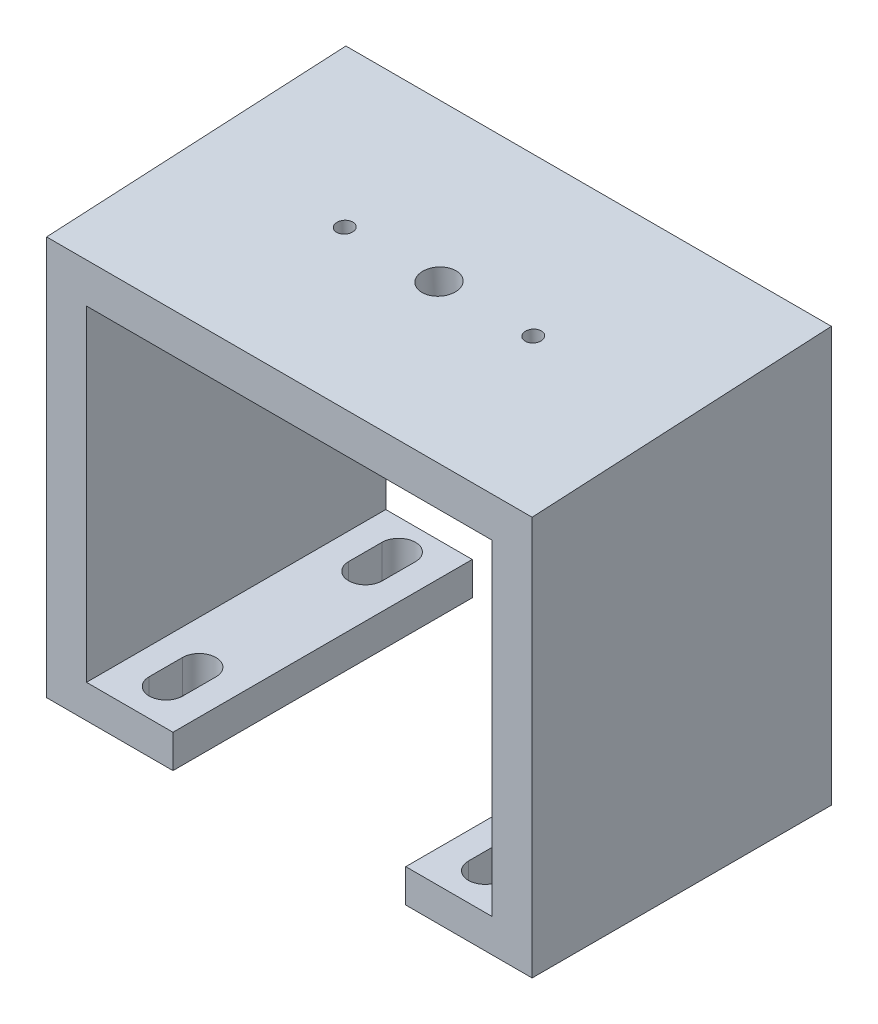
ISO-10303-21;
HEADER;
FILE_DESCRIPTION(('STEP AP214'),'2;1');
FILE_NAME('part.step','',(''),(''),'','','');
FILE_SCHEMA(('AUTOMOTIVE_DESIGN { 1 0 10303 214 1 1 1 1 }'));
ENDSEC;
DATA;
#1=APPLICATION_CONTEXT('core data for automotive mechanical design processes');
#2=APPLICATION_PROTOCOL_DEFINITION('international standard','automotive_design',2000,#1);
#3=PRODUCT_CONTEXT('',#1,'mechanical');
#4=PRODUCT('Part','Part','',(#3));
#5=PRODUCT_RELATED_PRODUCT_CATEGORY('part','',(#4));
#6=PRODUCT_DEFINITION_FORMATION('','',#4);
#7=PRODUCT_DEFINITION_CONTEXT('part definition',#1,'design');
#8=PRODUCT_DEFINITION('design','',#6,#7);
#9=PRODUCT_DEFINITION_SHAPE('','',#8);
#10=(LENGTH_UNIT() NAMED_UNIT(*) SI_UNIT(.MILLI.,.METRE.));
#11=(NAMED_UNIT(*) PLANE_ANGLE_UNIT() SI_UNIT($,.RADIAN.));
#12=(NAMED_UNIT(*) SI_UNIT($,.STERADIAN.) SOLID_ANGLE_UNIT());
#13=UNCERTAINTY_MEASURE_WITH_UNIT(LENGTH_MEASURE(1.E-05),#10,'distance_accuracy_value','');
#14=(GEOMETRIC_REPRESENTATION_CONTEXT(3) GLOBAL_UNCERTAINTY_ASSIGNED_CONTEXT((#13)) GLOBAL_UNIT_ASSIGNED_CONTEXT((#10,
#11,#12)) REPRESENTATION_CONTEXT('',''));
#15=CARTESIAN_POINT('',(0.,0.,0.));
#16=DIRECTION('',(0.,0.,1.));
#17=DIRECTION('',(1.,0.,0.));
#18=AXIS2_PLACEMENT_3D('',#15,#16,#17);
#19=CARTESIAN_POINT('',(38.735,-69.85,57.15));
#20=DIRECTION('',(0.,-1.,0.));
#21=DIRECTION('',(0.,0.,-1.));
#22=AXIS2_PLACEMENT_3D('',#19,#20,#21);
#23=PLANE('',#22);
#24=CARTESIAN_POINT('',(30.48,-69.85,50.2348227778499));
#25=DIRECTION('',(0.,-1.,0.));
#26=DIRECTION('',(0.,0.,1.));
#27=AXIS2_PLACEMENT_3D('',#24,#25,#26);
#28=CIRCLE('',#27,3.20294);
#29=CARTESIAN_POINT('',(33.68294,-69.85,50.2348227778499));
#30=VERTEX_POINT('',#29);
#31=CARTESIAN_POINT('',(27.27706,-69.85,50.2348227778499));
#32=VERTEX_POINT('',#31);
#33=EDGE_CURVE('E68',#30,#32,#28,.T.);
#34=ORIENTED_EDGE('',*,*,#33,.T.);
#35=DIRECTION('',(0.,0.,-1.));
#36=VECTOR('',#35,1.);
#37=CARTESIAN_POINT('',(27.27706,-69.85,50.2348227778499));
#38=LINE('',#37,#36);
#39=CARTESIAN_POINT('',(27.27706,-69.85,43.8848227778499));
#40=VERTEX_POINT('',#39);
#41=EDGE_CURVE('E299',#32,#40,#38,.T.);
#42=ORIENTED_EDGE('',*,*,#41,.T.);
#43=CARTESIAN_POINT('',(30.48,-69.85,43.8848227778499));
#44=DIRECTION('',(0.,-1.,0.));
#45=DIRECTION('',(0.,0.,1.));
#46=AXIS2_PLACEMENT_3D('',#43,#44,#45);
#47=CIRCLE('',#46,3.20294);
#48=CARTESIAN_POINT('',(33.68294,-69.85,43.8848227778499));
#49=VERTEX_POINT('',#48);
#50=EDGE_CURVE('E311',#40,#49,#47,.T.);
#51=ORIENTED_EDGE('',*,*,#50,.T.);
#52=DIRECTION('',(0.,0.,1.));
#53=VECTOR('',#52,1.);
#54=CARTESIAN_POINT('',(33.68294,-69.85,50.2348227778499));
#55=LINE('',#54,#53);
#56=EDGE_CURVE('E308',#49,#30,#55,.T.);
#57=ORIENTED_EDGE('',*,*,#56,.T.);
#58=EDGE_LOOP('',(#34,#42,#51,#57));
#59=FACE_BOUND('',#58,.T.);
#60=DIRECTION('',(-1.,0.,0.));
#61=VECTOR('',#60,1.);
#62=CARTESIAN_POINT('',(38.735,-69.85,0.));
#63=LINE('',#62,#61);
#64=CARTESIAN_POINT('',(38.735,-69.85,0.));
#65=VERTEX_POINT('',#64);
#66=CARTESIAN_POINT('',(22.225,-69.85,0.));
#67=VERTEX_POINT('',#66);
#68=EDGE_CURVE('E427',#65,#67,#63,.T.);
#69=ORIENTED_EDGE('',*,*,#68,.T.);
#70=DIRECTION('',(0.,0.,-1.));
#71=VECTOR('',#70,1.);
#72=CARTESIAN_POINT('',(22.225,-69.85,57.15));
#73=LINE('',#72,#71);
#74=CARTESIAN_POINT('',(22.225,-69.85,57.15));
#75=VERTEX_POINT('',#74);
#76=EDGE_CURVE('E439',#75,#67,#73,.T.);
#77=ORIENTED_EDGE('',*,*,#76,.F.);
#78=DIRECTION('',(-1.,0.,0.));
#79=VECTOR('',#78,1.);
#80=CARTESIAN_POINT('',(38.735,-69.85,57.15));
#81=LINE('',#80,#79);
#82=CARTESIAN_POINT('',(38.735,-69.85,57.15));
#83=VERTEX_POINT('',#82);
#84=EDGE_CURVE('E401',#83,#75,#81,.T.);
#85=ORIENTED_EDGE('',*,*,#84,.F.);
#86=DIRECTION('',(0.,0.,-1.));
#87=VECTOR('',#86,1.);
#88=CARTESIAN_POINT('',(38.735,-69.85,57.15));
#89=LINE('',#88,#87);
#90=EDGE_CURVE('E442',#83,#65,#89,.T.);
#91=ORIENTED_EDGE('',*,*,#90,.T.);
#92=EDGE_LOOP('',(#69,#77,#85,#91));
#93=FACE_BOUND('',#92,.T.);
#94=CARTESIAN_POINT('',(30.48,-69.85,5.78482277784992));
#95=DIRECTION('',(0.,-1.,0.));
#96=DIRECTION('',(0.,0.,1.));
#97=AXIS2_PLACEMENT_3D('',#94,#95,#96);
#98=CIRCLE('',#97,3.20294);
#99=CARTESIAN_POINT('',(27.27706,-69.85,5.78482277784992));
#100=VERTEX_POINT('',#99);
#101=CARTESIAN_POINT('',(33.68294,-69.85,5.78482277784992));
#102=VERTEX_POINT('',#101);
#103=EDGE_CURVE('E60',#100,#102,#98,.T.);
#104=ORIENTED_EDGE('',*,*,#103,.T.);
#105=DIRECTION('',(0.,0.,1.));
#106=VECTOR('',#105,1.);
#107=CARTESIAN_POINT('',(33.68294,-69.85,5.78482277784992));
#108=LINE('',#107,#106);
#109=CARTESIAN_POINT('',(33.68294,-69.85,12.1348227778499));
#110=VERTEX_POINT('',#109);
#111=EDGE_CURVE('E270',#102,#110,#108,.T.);
#112=ORIENTED_EDGE('',*,*,#111,.T.);
#113=CARTESIAN_POINT('',(30.48,-69.85,12.1348227778499));
#114=DIRECTION('',(0.,-1.,0.));
#115=DIRECTION('',(0.,0.,1.));
#116=AXIS2_PLACEMENT_3D('',#113,#114,#115);
#117=CIRCLE('',#116,3.20294);
#118=CARTESIAN_POINT('',(27.27706,-69.85,12.1348227778499));
#119=VERTEX_POINT('',#118);
#120=EDGE_CURVE('E283',#110,#119,#117,.T.);
#121=ORIENTED_EDGE('',*,*,#120,.T.);
#122=DIRECTION('',(0.,0.,-1.));
#123=VECTOR('',#122,1.);
#124=CARTESIAN_POINT('',(27.27706,-69.85,5.78482277784992));
#125=LINE('',#124,#123);
#126=EDGE_CURVE('E279',#119,#100,#125,.T.);
#127=ORIENTED_EDGE('',*,*,#126,.T.);
#128=EDGE_LOOP('',(#104,#112,#121,#127));
#129=FACE_BOUND('',#128,.T.);
#130=ADVANCED_FACE('F45',(#59,#93,#129),#23,.F.);
#131=CARTESIAN_POINT('',(46.355,-76.2,57.15));
#132=DIRECTION('',(0.,-1.,0.));
#133=DIRECTION('',(0.,0.,-1.));
#134=AXIS2_PLACEMENT_3D('',#131,#132,#133);
#135=PLANE('',#134);
#136=DIRECTION('',(-1.,0.,0.));
#137=VECTOR('',#136,1.);
#138=CARTESIAN_POINT('',(46.355,-76.2,0.));
#139=LINE('',#138,#137);
#140=CARTESIAN_POINT('',(46.355,-76.2,0.));
#141=VERTEX_POINT('',#140);
#142=CARTESIAN_POINT('',(22.225,-76.2,0.));
#143=VERTEX_POINT('',#142);
#144=EDGE_CURVE('E432',#141,#143,#139,.T.);
#145=ORIENTED_EDGE('',*,*,#144,.F.);
#146=DIRECTION('',(0.,0.,-1.));
#147=VECTOR('',#146,1.);
#148=CARTESIAN_POINT('',(46.355,-76.2,57.15));
#149=LINE('',#148,#147);
#150=CARTESIAN_POINT('',(46.355,-76.2,57.15));
#151=VERTEX_POINT('',#150);
#152=EDGE_CURVE('E412',#151,#141,#149,.T.);
#153=ORIENTED_EDGE('',*,*,#152,.F.);
#154=DIRECTION('',(-1.,0.,0.));
#155=VECTOR('',#154,1.);
#156=CARTESIAN_POINT('',(46.355,-76.2,57.15));
#157=LINE('',#156,#155);
#158=CARTESIAN_POINT('',(22.225,-76.2,57.15));
#159=VERTEX_POINT('',#158);
#160=EDGE_CURVE('E405',#151,#159,#157,.T.);
#161=ORIENTED_EDGE('',*,*,#160,.T.);
#162=DIRECTION('',(0.,0.,-1.));
#163=VECTOR('',#162,1.);
#164=CARTESIAN_POINT('',(22.225,-76.2,57.15));
#165=LINE('',#164,#163);
#166=EDGE_CURVE('E437',#159,#143,#165,.T.);
#167=ORIENTED_EDGE('',*,*,#166,.T.);
#168=EDGE_LOOP('',(#145,#153,#161,#167));
#169=FACE_BOUND('',#168,.T.);
#170=DIRECTION('',(0.,0.,-1.));
#171=VECTOR('',#170,1.);
#172=CARTESIAN_POINT('',(27.27706,-76.2,50.2348227778499));
#173=LINE('',#172,#171);
#174=CARTESIAN_POINT('',(27.27706,-76.2,50.2348227778499));
#175=VERTEX_POINT('',#174);
#176=CARTESIAN_POINT('',(27.27706,-76.2,43.8848227778499));
#177=VERTEX_POINT('',#176);
#178=EDGE_CURVE('E304',#175,#177,#173,.T.);
#179=ORIENTED_EDGE('',*,*,#178,.F.);
#180=CARTESIAN_POINT('',(30.48,-76.2,50.2348227778499));
#181=DIRECTION('',(0.,-1.,0.));
#182=DIRECTION('',(0.,0.,1.));
#183=AXIS2_PLACEMENT_3D('',#180,#181,#182);
#184=CIRCLE('',#183,3.20294);
#185=CARTESIAN_POINT('',(33.68294,-76.2,50.2348227778499));
#186=VERTEX_POINT('',#185);
#187=EDGE_CURVE('E296',#186,#175,#184,.T.);
#188=ORIENTED_EDGE('',*,*,#187,.F.);
#189=DIRECTION('',(0.,0.,1.));
#190=VECTOR('',#189,1.);
#191=CARTESIAN_POINT('',(33.68294,-76.2,50.2348227778499));
#192=LINE('',#191,#190);
#193=CARTESIAN_POINT('',(33.68294,-76.2,43.8848227778499));
#194=VERTEX_POINT('',#193);
#195=EDGE_CURVE('E298',#194,#186,#192,.T.);
#196=ORIENTED_EDGE('',*,*,#195,.F.);
#197=CARTESIAN_POINT('',(30.48,-76.2,43.8848227778499));
#198=DIRECTION('',(0.,-1.,0.));
#199=DIRECTION('',(0.,0.,1.));
#200=AXIS2_PLACEMENT_3D('',#197,#198,#199);
#201=CIRCLE('',#200,3.20294);
#202=EDGE_CURVE('E301',#177,#194,#201,.T.);
#203=ORIENTED_EDGE('',*,*,#202,.F.);
#204=EDGE_LOOP('',(#179,#188,#196,#203));
#205=FACE_BOUND('',#204,.T.);
#206=DIRECTION('',(0.,0.,1.));
#207=VECTOR('',#206,1.);
#208=CARTESIAN_POINT('',(33.68294,-76.2,5.78482277784992));
#209=LINE('',#208,#207);
#210=CARTESIAN_POINT('',(33.68294,-76.2,5.78482277784992));
#211=VERTEX_POINT('',#210);
#212=CARTESIAN_POINT('',(33.68294,-76.2,12.1348227778499));
#213=VERTEX_POINT('',#212);
#214=EDGE_CURVE('E275',#211,#213,#209,.T.);
#215=ORIENTED_EDGE('',*,*,#214,.F.);
#216=CARTESIAN_POINT('',(30.48,-76.2,5.78482277784992));
#217=DIRECTION('',(0.,-1.,0.));
#218=DIRECTION('',(0.,0.,1.));
#219=AXIS2_PLACEMENT_3D('',#216,#217,#218);
#220=CIRCLE('',#219,3.20294);
#221=CARTESIAN_POINT('',(27.27706,-76.2,5.78482277784992));
#222=VERTEX_POINT('',#221);
#223=EDGE_CURVE('E267',#222,#211,#220,.T.);
#224=ORIENTED_EDGE('',*,*,#223,.F.);
#225=DIRECTION('',(0.,0.,-1.));
#226=VECTOR('',#225,1.);
#227=CARTESIAN_POINT('',(27.27706,-76.2,5.78482277784992));
#228=LINE('',#227,#226);
#229=CARTESIAN_POINT('',(27.27706,-76.2,12.1348227778499));
#230=VERTEX_POINT('',#229);
#231=EDGE_CURVE('E269',#230,#222,#228,.T.);
#232=ORIENTED_EDGE('',*,*,#231,.F.);
#233=CARTESIAN_POINT('',(30.48,-76.2,12.1348227778499));
#234=DIRECTION('',(0.,-1.,0.));
#235=DIRECTION('',(0.,0.,1.));
#236=AXIS2_PLACEMENT_3D('',#233,#234,#235);
#237=CIRCLE('',#236,3.20294);
#238=EDGE_CURVE('E272',#213,#230,#237,.T.);
#239=ORIENTED_EDGE('',*,*,#238,.F.);
#240=EDGE_LOOP('',(#215,#224,#232,#239));
#241=FACE_BOUND('',#240,.T.);
#242=ADVANCED_FACE('F476',(#169,#205,#241),#135,.T.);
#243=CARTESIAN_POINT('',(-46.355,0.,57.15));
#244=DIRECTION('',(1.,0.,0.));
#245=DIRECTION('',(0.,1.,0.));
#246=AXIS2_PLACEMENT_3D('',#243,#244,#245);
#247=PLANE('',#246);
#248=DIRECTION('',(0.,-1.,0.));
#249=VECTOR('',#248,1.);
#250=CARTESIAN_POINT('',(-46.355,0.,0.));
#251=LINE('',#250,#249);
#252=CARTESIAN_POINT('',(-46.355,2.9951045860254,0.));
#253=VERTEX_POINT('',#252);
#254=CARTESIAN_POINT('',(-46.355,-76.2,0.));
#255=VERTEX_POINT('',#254);
#256=EDGE_CURVE('E234',#253,#255,#251,.T.);
#257=ORIENTED_EDGE('',*,*,#256,.T.);
#258=DIRECTION('',(0.,0.,-1.));
#259=VECTOR('',#258,1.);
#260=CARTESIAN_POINT('',(-46.355,-76.2,57.15));
#261=LINE('',#260,#259);
#262=CARTESIAN_POINT('',(-46.355,-76.2,57.15));
#263=VERTEX_POINT('',#262);
#264=EDGE_CURVE('E11',#263,#255,#261,.T.);
#265=ORIENTED_EDGE('',*,*,#264,.F.);
#266=DIRECTION('',(0.,-1.,0.));
#267=VECTOR('',#266,1.);
#268=CARTESIAN_POINT('',(-46.355,0.,57.15));
#269=LINE('',#268,#267);
#270=CARTESIAN_POINT('',(-46.355,0.,57.15));
#271=VERTEX_POINT('',#270);
#272=EDGE_CURVE('E257',#271,#263,#269,.T.);
#273=ORIENTED_EDGE('',*,*,#272,.F.);
#274=DIRECTION('',(0.,0.0523359562429368,-0.998629534754574));
#275=VECTOR('',#274,1.);
#276=CARTESIAN_POINT('',(-46.355,2.9951045860254,0.));
#277=LINE('',#276,#275);
#278=EDGE_CURVE('E252',#271,#253,#277,.T.);
#279=ORIENTED_EDGE('',*,*,#278,.T.);
#280=EDGE_LOOP('',(#257,#265,#273,#279));
#281=FACE_BOUND('',#280,.T.);
#282=ADVANCED_FACE('F47',(#281),#247,.F.);
#283=CARTESIAN_POINT('',(-46.355,-76.2,57.15));
#284=DIRECTION('',(0.,1.,0.));
#285=DIRECTION('',(0.,0.,1.));
#286=AXIS2_PLACEMENT_3D('',#283,#284,#285);
#287=PLANE('',#286);
#288=DIRECTION('',(0.,0.,-1.));
#289=VECTOR('',#288,1.);
#290=CARTESIAN_POINT('',(-27.27706,-76.2,5.78482277784992));
#291=LINE('',#290,#289);
#292=CARTESIAN_POINT('',(-27.27706,-76.2,12.1348227778499));
#293=VERTEX_POINT('',#292);
#294=CARTESIAN_POINT('',(-27.27706,-76.2,5.78482277784992));
#295=VERTEX_POINT('',#294);
#296=EDGE_CURVE('E332',#293,#295,#291,.T.);
#297=ORIENTED_EDGE('',*,*,#296,.T.);
#298=CARTESIAN_POINT('',(-30.48,-76.2,5.78482277784992));
#299=DIRECTION('',(0.,1.,0.));
#300=DIRECTION('',(0.,0.,1.));
#301=AXIS2_PLACEMENT_3D('',#298,#299,#300);
#302=CIRCLE('',#301,3.20294);
#303=CARTESIAN_POINT('',(-33.68294,-76.2,5.78482277784992));
#304=VERTEX_POINT('',#303);
#305=EDGE_CURVE('E322',#295,#304,#302,.T.);
#306=ORIENTED_EDGE('',*,*,#305,.T.);
#307=DIRECTION('',(0.,0.,1.));
#308=VECTOR('',#307,1.);
#309=CARTESIAN_POINT('',(-33.68294,-76.2,5.78482277784992));
#310=LINE('',#309,#308);
#311=CARTESIAN_POINT('',(-33.68294,-76.2,12.1348227778499));
#312=VERTEX_POINT('',#311);
#313=EDGE_CURVE('E325',#304,#312,#310,.T.);
#314=ORIENTED_EDGE('',*,*,#313,.T.);
#315=CARTESIAN_POINT('',(-30.48,-76.2,12.1348227778499));
#316=DIRECTION('',(0.,1.,0.));
#317=DIRECTION('',(0.,0.,1.));
#318=AXIS2_PLACEMENT_3D('',#315,#316,#317);
#319=CIRCLE('',#318,3.20294);
#320=EDGE_CURVE('E329',#312,#293,#319,.T.);
#321=ORIENTED_EDGE('',*,*,#320,.T.);
#322=EDGE_LOOP('',(#297,#306,#314,#321));
#323=FACE_BOUND('',#322,.T.);
#324=DIRECTION('',(0.,0.,1.));
#325=VECTOR('',#324,1.);
#326=CARTESIAN_POINT('',(-33.68294,-76.2,50.2348227778499));
#327=LINE('',#326,#325);
#328=CARTESIAN_POINT('',(-33.68294,-76.2,43.8848227778499));
#329=VERTEX_POINT('',#328);
#330=CARTESIAN_POINT('',(-33.68294,-76.2,50.2348227778499));
#331=VERTEX_POINT('',#330);
#332=EDGE_CURVE('E357',#329,#331,#327,.T.);
#333=ORIENTED_EDGE('',*,*,#332,.T.);
#334=CARTESIAN_POINT('',(-30.48,-76.2,50.2348227778499));
#335=DIRECTION('',(0.,1.,0.));
#336=DIRECTION('',(0.,0.,1.));
#337=AXIS2_PLACEMENT_3D('',#334,#335,#336);
#338=CIRCLE('',#337,3.20294);
#339=CARTESIAN_POINT('',(-27.27706,-76.2,50.2348227778499));
#340=VERTEX_POINT('',#339);
#341=EDGE_CURVE('E367',#331,#340,#338,.T.);
#342=ORIENTED_EDGE('',*,*,#341,.T.);
#343=DIRECTION('',(0.,0.,-1.));
#344=VECTOR('',#343,1.);
#345=CARTESIAN_POINT('',(-27.27706,-76.2,50.2348227778499));
#346=LINE('',#345,#344);
#347=CARTESIAN_POINT('',(-27.27706,-76.2,43.8848227778499));
#348=VERTEX_POINT('',#347);
#349=EDGE_CURVE('E379',#340,#348,#346,.T.);
#350=ORIENTED_EDGE('',*,*,#349,.T.);
#351=CARTESIAN_POINT('',(-30.48,-76.2,43.8848227778499));
#352=DIRECTION('',(0.,1.,0.));
#353=DIRECTION('',(0.,0.,1.));
#354=AXIS2_PLACEMENT_3D('',#351,#352,#353);
#355=CIRCLE('',#354,3.20294);
#356=EDGE_CURVE('E376',#348,#329,#355,.T.);
#357=ORIENTED_EDGE('',*,*,#356,.T.);
#358=EDGE_LOOP('',(#333,#342,#350,#357));
#359=FACE_BOUND('',#358,.T.);
#360=DIRECTION('',(1.,0.,0.));
#361=VECTOR('',#360,1.);
#362=CARTESIAN_POINT('',(-46.355,-76.2,0.));
#363=LINE('',#362,#361);
#364=CARTESIAN_POINT('',(-22.225,-76.2,0.));
#365=VERTEX_POINT('',#364);
#366=EDGE_CURVE('E241',#255,#365,#363,.T.);
#367=ORIENTED_EDGE('',*,*,#366,.T.);
#368=DIRECTION('',(0.,0.,-1.));
#369=VECTOR('',#368,1.);
#370=CARTESIAN_POINT('',(-22.225,-76.2,57.15));
#371=LINE('',#370,#369);
#372=CARTESIAN_POINT('',(-22.225,-76.2,57.15));
#373=VERTEX_POINT('',#372);
#374=EDGE_CURVE('E53',#373,#365,#371,.T.);
#375=ORIENTED_EDGE('',*,*,#374,.F.);
#376=DIRECTION('',(1.,0.,0.));
#377=VECTOR('',#376,1.);
#378=CARTESIAN_POINT('',(-46.355,-76.2,57.15));
#379=LINE('',#378,#377);
#380=EDGE_CURVE('E385',#263,#373,#379,.T.);
#381=ORIENTED_EDGE('',*,*,#380,.F.);
#382=ORIENTED_EDGE('',*,*,#264,.T.);
#383=EDGE_LOOP('',(#367,#375,#381,#382));
#384=FACE_BOUND('',#383,.T.);
#385=ADVANCED_FACE('F459',(#323,#359,#384),#287,.F.);
#386=CARTESIAN_POINT('',(-22.225,-69.85,57.15));
#387=DIRECTION('',(1.,0.,0.));
#388=DIRECTION('',(0.,0.,-1.));
#389=AXIS2_PLACEMENT_3D('',#386,#387,#388);
#390=PLANE('',#389);
#391=DIRECTION('',(0.,-1.,0.));
#392=VECTOR('',#391,1.);
#393=CARTESIAN_POINT('',(-22.225,-69.85,0.));
#394=LINE('',#393,#392);
#395=CARTESIAN_POINT('',(-22.225,-69.85,0.));
#396=VERTEX_POINT('',#395);
#397=EDGE_CURVE('E415',#396,#365,#394,.T.);
#398=ORIENTED_EDGE('',*,*,#397,.F.);
#399=DIRECTION('',(0.,0.,-1.));
#400=VECTOR('',#399,1.);
#401=CARTESIAN_POINT('',(-22.225,-69.85,57.15));
#402=LINE('',#401,#400);
#403=CARTESIAN_POINT('',(-22.225,-69.85,57.15));
#404=VERTEX_POINT('',#403);
#405=EDGE_CURVE('E452',#404,#396,#402,.T.);
#406=ORIENTED_EDGE('',*,*,#405,.F.);
#407=DIRECTION('',(0.,-1.,0.));
#408=VECTOR('',#407,1.);
#409=CARTESIAN_POINT('',(-22.225,-69.85,57.15));
#410=LINE('',#409,#408);
#411=EDGE_CURVE('E388',#404,#373,#410,.T.);
#412=ORIENTED_EDGE('',*,*,#411,.T.);
#413=ORIENTED_EDGE('',*,*,#374,.T.);
#414=EDGE_LOOP('',(#398,#406,#412,#413));
#415=FACE_BOUND('',#414,.T.);
#416=ADVANCED_FACE('F456',(#415),#390,.T.);
#417=CARTESIAN_POINT('',(-38.735,-69.85,57.15));
#418=DIRECTION('',(0.,1.,0.));
#419=DIRECTION('',(0.,0.,1.));
#420=AXIS2_PLACEMENT_3D('',#417,#418,#419);
#421=PLANE('',#420);
#422=CARTESIAN_POINT('',(-30.48,-69.85,5.78482277784992));
#423=DIRECTION('',(0.,1.,0.));
#424=DIRECTION('',(0.,0.,1.));
#425=AXIS2_PLACEMENT_3D('',#422,#423,#424);
#426=CIRCLE('',#425,3.20294);
#427=CARTESIAN_POINT('',(-27.27706,-69.85,5.78482277784992));
#428=VERTEX_POINT('',#427);
#429=CARTESIAN_POINT('',(-33.68294,-69.85,5.78482277784992));
#430=VERTEX_POINT('',#429);
#431=EDGE_CURVE('E336',#428,#430,#426,.T.);
#432=ORIENTED_EDGE('',*,*,#431,.F.);
#433=DIRECTION('',(0.,0.,-1.));
#434=VECTOR('',#433,1.);
#435=CARTESIAN_POINT('',(-27.27706,-69.85,5.78482277784992));
#436=LINE('',#435,#434);
#437=CARTESIAN_POINT('',(-27.27706,-69.85,12.1348227778499));
#438=VERTEX_POINT('',#437);
#439=EDGE_CURVE('E326',#438,#428,#436,.T.);
#440=ORIENTED_EDGE('',*,*,#439,.F.);
#441=CARTESIAN_POINT('',(-30.48,-69.85,12.1348227778499));
#442=DIRECTION('',(0.,1.,0.));
#443=DIRECTION('',(0.,0.,1.));
#444=AXIS2_PLACEMENT_3D('',#441,#442,#443);
#445=CIRCLE('',#444,3.20294);
#446=CARTESIAN_POINT('',(-33.68294,-69.85,12.1348227778499));
#447=VERTEX_POINT('',#446);
#448=EDGE_CURVE('E342',#447,#438,#445,.T.);
#449=ORIENTED_EDGE('',*,*,#448,.F.);
#450=DIRECTION('',(0.,0.,1.));
#451=VECTOR('',#450,1.);
#452=CARTESIAN_POINT('',(-33.68294,-69.85,5.78482277784992));
#453=LINE('',#452,#451);
#454=EDGE_CURVE('E338',#430,#447,#453,.T.);
#455=ORIENTED_EDGE('',*,*,#454,.F.);
#456=EDGE_LOOP('',(#432,#440,#449,#455));
#457=FACE_BOUND('',#456,.T.);
#458=CARTESIAN_POINT('',(-30.48,-69.85,50.2348227778499));
#459=DIRECTION('',(0.,1.,0.));
#460=DIRECTION('',(0.,0.,1.));
#461=AXIS2_PLACEMENT_3D('',#458,#459,#460);
#462=CIRCLE('',#461,3.20294);
#463=CARTESIAN_POINT('',(-33.68294,-69.85,50.2348227778499));
#464=VERTEX_POINT('',#463);
#465=CARTESIAN_POINT('',(-27.27706,-69.85,50.2348227778499));
#466=VERTEX_POINT('',#465);
#467=EDGE_CURVE('E339',#464,#466,#462,.T.);
#468=ORIENTED_EDGE('',*,*,#467,.F.);
#469=DIRECTION('',(0.,0.,1.));
#470=VECTOR('',#469,1.);
#471=CARTESIAN_POINT('',(-33.68294,-69.85,50.2348227778499));
#472=LINE('',#471,#470);
#473=CARTESIAN_POINT('',(-33.68294,-69.85,43.8848227778499));
#474=VERTEX_POINT('',#473);
#475=EDGE_CURVE('E363',#474,#464,#472,.T.);
#476=ORIENTED_EDGE('',*,*,#475,.F.);
#477=CARTESIAN_POINT('',(-30.48,-69.85,43.8848227778499));
#478=DIRECTION('',(0.,1.,0.));
#479=DIRECTION('',(0.,0.,1.));
#480=AXIS2_PLACEMENT_3D('',#477,#478,#479);
#481=CIRCLE('',#480,3.20294);
#482=CARTESIAN_POINT('',(-27.27706,-69.85,43.8848227778499));
#483=VERTEX_POINT('',#482);
#484=EDGE_CURVE('E366',#483,#474,#481,.T.);
#485=ORIENTED_EDGE('',*,*,#484,.F.);
#486=DIRECTION('',(0.,0.,-1.));
#487=VECTOR('',#486,1.);
#488=CARTESIAN_POINT('',(-27.27706,-69.85,50.2348227778499));
#489=LINE('',#488,#487);
#490=EDGE_CURVE('E370',#466,#483,#489,.T.);
#491=ORIENTED_EDGE('',*,*,#490,.F.);
#492=EDGE_LOOP('',(#468,#476,#485,#491));
#493=FACE_BOUND('',#492,.T.);
#494=DIRECTION('',(1.,0.,0.));
#495=VECTOR('',#494,1.);
#496=CARTESIAN_POINT('',(-38.735,-69.85,0.));
#497=LINE('',#496,#495);
#498=CARTESIAN_POINT('',(-38.735,-69.85,0.));
#499=VERTEX_POINT('',#498);
#500=EDGE_CURVE('E417',#499,#396,#497,.T.);
#501=ORIENTED_EDGE('',*,*,#500,.F.);
#502=DIRECTION('',(0.,0.,-1.));
#503=VECTOR('',#502,1.);
#504=CARTESIAN_POINT('',(-38.735,-69.85,57.15));
#505=LINE('',#504,#503);
#506=CARTESIAN_POINT('',(-38.735,-69.85,57.15));
#507=VERTEX_POINT('',#506);
#508=EDGE_CURVE('E450',#507,#499,#505,.T.);
#509=ORIENTED_EDGE('',*,*,#508,.F.);
#510=DIRECTION('',(1.,0.,0.));
#511=VECTOR('',#510,1.);
#512=CARTESIAN_POINT('',(-38.735,-69.85,57.15));
#513=LINE('',#512,#511);
#514=EDGE_CURVE('E391',#507,#404,#513,.T.);
#515=ORIENTED_EDGE('',*,*,#514,.T.);
#516=ORIENTED_EDGE('',*,*,#405,.T.);
#517=EDGE_LOOP('',(#501,#509,#515,#516));
#518=FACE_BOUND('',#517,.T.);
#519=ADVANCED_FACE('F464',(#457,#493,#518),#421,.T.);
#520=CARTESIAN_POINT('',(-38.735,-7.62,57.15));
#521=DIRECTION('',(1.,0.,0.));
#522=DIRECTION('',(0.,0.,-1.));
#523=AXIS2_PLACEMENT_3D('',#520,#521,#522);
#524=PLANE('',#523);
#525=DIRECTION('',(0.,-1.,0.));
#526=VECTOR('',#525,1.);
#527=CARTESIAN_POINT('',(-38.735,-7.62,0.));
#528=LINE('',#527,#526);
#529=CARTESIAN_POINT('',(-38.735,-7.62,0.));
#530=VERTEX_POINT('',#529);
#531=EDGE_CURVE('E420',#530,#499,#528,.T.);
#532=ORIENTED_EDGE('',*,*,#531,.F.);
#533=DIRECTION('',(0.,0.,-1.));
#534=VECTOR('',#533,1.);
#535=CARTESIAN_POINT('',(-38.735,-7.62,57.15));
#536=LINE('',#535,#534);
#537=CARTESIAN_POINT('',(-38.735,-7.62,57.15));
#538=VERTEX_POINT('',#537);
#539=EDGE_CURVE('E448',#538,#530,#536,.T.);
#540=ORIENTED_EDGE('',*,*,#539,.F.);
#541=DIRECTION('',(0.,-1.,0.));
#542=VECTOR('',#541,1.);
#543=CARTESIAN_POINT('',(-38.735,-7.62,57.15));
#544=LINE('',#543,#542);
#545=EDGE_CURVE('E394',#538,#507,#544,.T.);
#546=ORIENTED_EDGE('',*,*,#545,.T.);
#547=ORIENTED_EDGE('',*,*,#508,.T.);
#548=EDGE_LOOP('',(#532,#540,#546,#547));
#549=FACE_BOUND('',#548,.T.);
#550=ADVANCED_FACE('F496',(#549),#524,.T.);
#551=CARTESIAN_POINT('',(-38.735,-7.62,57.15));
#552=DIRECTION('',(0.,1.,0.));
#553=DIRECTION('',(0.,0.,1.));
#554=AXIS2_PLACEMENT_3D('',#551,#552,#553);
#555=PLANE('',#554);
#556=CARTESIAN_POINT('',(-18.,-7.62,28.0971693318263));
#557=DIRECTION('',(0.,1.,0.));
#558=DIRECTION('',(0.,0.,1.));
#559=AXIS2_PLACEMENT_3D('',#556,#557,#558);
#560=ELLIPSE('',#559,1.55212713629678,1.55);
#561=CARTESIAN_POINT('',(-18.,-7.62,29.6492964681231));
#562=VERTEX_POINT('',#561);
#563=EDGE_CURVE('E615',#562,#562,#560,.T.);
#564=ORIENTED_EDGE('',*,*,#563,.T.);
#565=EDGE_LOOP('',(#564));
#566=FACE_BOUND('',#565,.T.);
#567=CARTESIAN_POINT('',(18.,-7.62,28.0971693318263));
#568=DIRECTION('',(0.,1.,0.));
#569=DIRECTION('',(0.,0.,1.));
#570=AXIS2_PLACEMENT_3D('',#567,#568,#569);
#571=ELLIPSE('',#570,1.55212713629678,1.55);
#572=CARTESIAN_POINT('',(18.,-7.62,29.6492964681231));
#573=VERTEX_POINT('',#572);
#574=EDGE_CURVE('E625',#573,#573,#571,.T.);
#575=ORIENTED_EDGE('',*,*,#574,.T.);
#576=EDGE_LOOP('',(#575));
#577=FACE_BOUND('',#576,.T.);
#578=CARTESIAN_POINT('',(0.,-7.62,28.0971693318263));
#579=DIRECTION('',(0.,1.,0.));
#580=DIRECTION('',(0.,0.,1.));
#581=AXIS2_PLACEMENT_3D('',#578,#579,#580);
#582=ELLIPSE('',#581,3.26837920010261,3.2639);
#583=CARTESIAN_POINT('',(0.,-7.62,31.3655485319289));
#584=VERTEX_POINT('',#583);
#585=EDGE_CURVE('E259',#584,#584,#582,.T.);
#586=ORIENTED_EDGE('',*,*,#585,.T.);
#587=EDGE_LOOP('',(#586));
#588=FACE_BOUND('',#587,.T.);
#589=DIRECTION('',(1.,0.,0.));
#590=VECTOR('',#589,1.);
#591=CARTESIAN_POINT('',(-38.735,-7.62,0.));
#592=LINE('',#591,#590);
#593=CARTESIAN_POINT('',(38.735,-7.62,0.));
#594=VERTEX_POINT('',#593);
#595=EDGE_CURVE('E423',#530,#594,#592,.T.);
#596=ORIENTED_EDGE('',*,*,#595,.T.);
#597=DIRECTION('',(0.,0.,-1.));
#598=VECTOR('',#597,1.);
#599=CARTESIAN_POINT('',(38.735,-7.62,57.15));
#600=LINE('',#599,#598);
#601=CARTESIAN_POINT('',(38.735,-7.62,57.15));
#602=VERTEX_POINT('',#601);
#603=EDGE_CURVE('E445',#602,#594,#600,.T.);
#604=ORIENTED_EDGE('',*,*,#603,.F.);
#605=DIRECTION('',(1.,0.,0.));
#606=VECTOR('',#605,1.);
#607=CARTESIAN_POINT('',(-38.735,-7.62,57.15));
#608=LINE('',#607,#606);
#609=EDGE_CURVE('E397',#538,#602,#608,.T.);
#610=ORIENTED_EDGE('',*,*,#609,.F.);
#611=ORIENTED_EDGE('',*,*,#539,.T.);
#612=EDGE_LOOP('',(#596,#604,#610,#611));
#613=FACE_BOUND('',#612,.T.);
#614=ADVANCED_FACE('F494',(#566,#577,#588,#613),#555,.F.);
#615=CARTESIAN_POINT('',(38.735,-7.62,57.15));
#616=DIRECTION('',(1.,0.,0.));
#617=DIRECTION('',(0.,0.,-1.));
#618=AXIS2_PLACEMENT_3D('',#615,#616,#617);
#619=PLANE('',#618);
#620=DIRECTION('',(0.,-1.,0.));
#621=VECTOR('',#620,1.);
#622=CARTESIAN_POINT('',(38.735,-7.62,0.));
#623=LINE('',#622,#621);
#624=EDGE_CURVE('E425',#594,#65,#623,.T.);
#625=ORIENTED_EDGE('',*,*,#624,.T.);
#626=ORIENTED_EDGE('',*,*,#90,.F.);
#627=DIRECTION('',(0.,-1.,0.));
#628=VECTOR('',#627,1.);
#629=CARTESIAN_POINT('',(38.735,-7.62,57.15));
#630=LINE('',#629,#628);
#631=EDGE_CURVE('E399',#602,#83,#630,.T.);
#632=ORIENTED_EDGE('',*,*,#631,.F.);
#633=ORIENTED_EDGE('',*,*,#603,.T.);
#634=EDGE_LOOP('',(#625,#626,#632,#633));
#635=FACE_BOUND('',#634,.T.);
#636=ADVANCED_FACE('F489',(#635),#619,.F.);
#637=CARTESIAN_POINT('',(22.225,-69.85,57.15));
#638=DIRECTION('',(1.,0.,0.));
#639=DIRECTION('',(0.,0.,-1.));
#640=AXIS2_PLACEMENT_3D('',#637,#638,#639);
#641=PLANE('',#640);
#642=DIRECTION('',(0.,-1.,0.));
#643=VECTOR('',#642,1.);
#644=CARTESIAN_POINT('',(22.225,-69.85,0.));
#645=LINE('',#644,#643);
#646=EDGE_CURVE('E429',#67,#143,#645,.T.);
#647=ORIENTED_EDGE('',*,*,#646,.T.);
#648=ORIENTED_EDGE('',*,*,#166,.F.);
#649=DIRECTION('',(0.,-1.,0.));
#650=VECTOR('',#649,1.);
#651=CARTESIAN_POINT('',(22.225,-69.85,57.15));
#652=LINE('',#651,#650);
#653=EDGE_CURVE('E403',#75,#159,#652,.T.);
#654=ORIENTED_EDGE('',*,*,#653,.F.);
#655=ORIENTED_EDGE('',*,*,#76,.T.);
#656=EDGE_LOOP('',(#647,#648,#654,#655));
#657=FACE_BOUND('',#656,.T.);
#658=ADVANCED_FACE('F481',(#657),#641,.F.);
#659=CARTESIAN_POINT('',(46.355,0.,57.15));
#660=DIRECTION('',(1.,0.,0.));
#661=DIRECTION('',(0.,1.,0.));
#662=AXIS2_PLACEMENT_3D('',#659,#660,#661);
#663=PLANE('',#662);
#664=DIRECTION('',(0.,-1.,0.));
#665=VECTOR('',#664,1.);
#666=CARTESIAN_POINT('',(46.355,0.,0.));
#667=LINE('',#666,#665);
#668=CARTESIAN_POINT('',(46.355,2.99510458602541,0.));
#669=VERTEX_POINT('',#668);
#670=EDGE_CURVE('E386',#669,#141,#667,.T.);
#671=ORIENTED_EDGE('',*,*,#670,.F.);
#672=DIRECTION('',(0.,0.0523359562429368,-0.998629534754574));
#673=VECTOR('',#672,1.);
#674=CARTESIAN_POINT('',(46.355,2.99510458602541,0.));
#675=LINE('',#674,#673);
#676=CARTESIAN_POINT('',(46.355,0.,57.15));
#677=VERTEX_POINT('',#676);
#678=EDGE_CURVE('E254',#677,#669,#675,.T.);
#679=ORIENTED_EDGE('',*,*,#678,.F.);
#680=DIRECTION('',(0.,-1.,0.));
#681=VECTOR('',#680,1.);
#682=CARTESIAN_POINT('',(46.355,0.,57.15));
#683=LINE('',#682,#681);
#684=EDGE_CURVE('E408',#677,#151,#683,.T.);
#685=ORIENTED_EDGE('',*,*,#684,.T.);
#686=ORIENTED_EDGE('',*,*,#152,.T.);
#687=EDGE_LOOP('',(#671,#679,#685,#686));
#688=FACE_BOUND('',#687,.T.);
#689=ADVANCED_FACE('F471',(#688),#663,.T.);
#690=CARTESIAN_POINT('',(0.,0.,57.15));
#691=DIRECTION('',(0.,0.,1.));
#692=DIRECTION('',(1.,0.,0.));
#693=AXIS2_PLACEMENT_3D('',#690,#691,#692);
#694=PLANE('',#693);
#695=ORIENTED_EDGE('',*,*,#272,.T.);
#696=ORIENTED_EDGE('',*,*,#380,.T.);
#697=ORIENTED_EDGE('',*,*,#411,.F.);
#698=ORIENTED_EDGE('',*,*,#514,.F.);
#699=ORIENTED_EDGE('',*,*,#545,.F.);
#700=ORIENTED_EDGE('',*,*,#609,.T.);
#701=ORIENTED_EDGE('',*,*,#631,.T.);
#702=ORIENTED_EDGE('',*,*,#84,.T.);
#703=ORIENTED_EDGE('',*,*,#653,.T.);
#704=ORIENTED_EDGE('',*,*,#160,.F.);
#705=ORIENTED_EDGE('',*,*,#684,.F.);
#706=DIRECTION('',(1.,0.,0.));
#707=VECTOR('',#706,1.);
#708=CARTESIAN_POINT('',(-46.355,0.,57.15));
#709=LINE('',#708,#707);
#710=EDGE_CURVE('E411',#271,#677,#709,.T.);
#711=ORIENTED_EDGE('',*,*,#710,.F.);
#712=EDGE_LOOP('',(#695,#696,#697,#698,#699,#700,#701,#702,#703,#704,#705,#711));
#713=FACE_BOUND('',#712,.T.);
#714=ADVANCED_FACE('F467',(#713),#694,.T.);
#715=CARTESIAN_POINT('',(0.,0.,0.));
#716=DIRECTION('',(0.,0.,1.));
#717=DIRECTION('',(1.,0.,0.));
#718=AXIS2_PLACEMENT_3D('',#715,#716,#717);
#719=PLANE('',#718);
#720=ORIENTED_EDGE('',*,*,#256,.F.);
#721=DIRECTION('',(-1.,0.,0.));
#722=VECTOR('',#721,1.);
#723=CARTESIAN_POINT('',(103.583429573781,2.99510458602541,0.));
#724=LINE('',#723,#722);
#725=EDGE_CURVE('E238',#669,#253,#724,.T.);
#726=ORIENTED_EDGE('',*,*,#725,.F.);
#727=ORIENTED_EDGE('',*,*,#670,.T.);
#728=ORIENTED_EDGE('',*,*,#144,.T.);
#729=ORIENTED_EDGE('',*,*,#646,.F.);
#730=ORIENTED_EDGE('',*,*,#68,.F.);
#731=ORIENTED_EDGE('',*,*,#624,.F.);
#732=ORIENTED_EDGE('',*,*,#595,.F.);
#733=ORIENTED_EDGE('',*,*,#531,.T.);
#734=ORIENTED_EDGE('',*,*,#500,.T.);
#735=ORIENTED_EDGE('',*,*,#397,.T.);
#736=ORIENTED_EDGE('',*,*,#366,.F.);
#737=EDGE_LOOP('',(#720,#726,#727,#728,#729,#730,#731,#732,#733,#734,#735,#736));
#738=FACE_BOUND('',#737,.T.);
#739=ADVANCED_FACE('F236',(#738),#719,.F.);
#740=CARTESIAN_POINT('',(-30.48,-76.2,50.2348227778499));
#741=DIRECTION('',(0.,1.,0.));
#742=DIRECTION('',(0.,0.,1.));
#743=AXIS2_PLACEMENT_3D('',#740,#741,#742);
#744=CYLINDRICAL_SURFACE('',#743,3.20294);
#745=ORIENTED_EDGE('',*,*,#467,.T.);
#746=DIRECTION('',(0.,1.,0.));
#747=VECTOR('',#746,1.);
#748=CARTESIAN_POINT('',(-27.27706,-76.2,50.2348227778499));
#749=LINE('',#748,#747);
#750=EDGE_CURVE('E354',#340,#466,#749,.T.);
#751=ORIENTED_EDGE('',*,*,#750,.F.);
#752=ORIENTED_EDGE('',*,*,#341,.F.);
#753=DIRECTION('',(0.,1.,0.));
#754=VECTOR('',#753,1.);
#755=CARTESIAN_POINT('',(-33.68294,-76.2,50.2348227778499));
#756=LINE('',#755,#754);
#757=EDGE_CURVE('E290',#331,#464,#756,.T.);
#758=ORIENTED_EDGE('',*,*,#757,.T.);
#759=EDGE_LOOP('',(#745,#751,#752,#758));
#760=FACE_BOUND('',#759,.T.);
#761=ADVANCED_FACE('F534',(#760),#744,.F.);
#762=CARTESIAN_POINT('',(-33.68294,-76.2,50.2348227778499));
#763=DIRECTION('',(-1.,0.,0.));
#764=DIRECTION('',(0.,0.,1.));
#765=AXIS2_PLACEMENT_3D('',#762,#763,#764);
#766=PLANE('',#765);
#767=ORIENTED_EDGE('',*,*,#475,.T.);
#768=ORIENTED_EDGE('',*,*,#757,.F.);
#769=ORIENTED_EDGE('',*,*,#332,.F.);
#770=DIRECTION('',(0.,1.,0.));
#771=VECTOR('',#770,1.);
#772=CARTESIAN_POINT('',(-33.68294,-76.2,43.8848227778499));
#773=LINE('',#772,#771);
#774=EDGE_CURVE('E360',#329,#474,#773,.T.);
#775=ORIENTED_EDGE('',*,*,#774,.T.);
#776=EDGE_LOOP('',(#767,#768,#769,#775));
#777=FACE_BOUND('',#776,.T.);
#778=ADVANCED_FACE('F536',(#777),#766,.F.);
#779=CARTESIAN_POINT('',(-30.48,-76.2,43.8848227778499));
#780=DIRECTION('',(0.,1.,0.));
#781=DIRECTION('',(0.,0.,1.));
#782=AXIS2_PLACEMENT_3D('',#779,#780,#781);
#783=CYLINDRICAL_SURFACE('',#782,3.20294);
#784=ORIENTED_EDGE('',*,*,#484,.T.);
#785=ORIENTED_EDGE('',*,*,#774,.F.);
#786=ORIENTED_EDGE('',*,*,#356,.F.);
#787=DIRECTION('',(0.,1.,0.));
#788=VECTOR('',#787,1.);
#789=CARTESIAN_POINT('',(-27.27706,-76.2,43.8848227778499));
#790=LINE('',#789,#788);
#791=EDGE_CURVE('E358',#348,#483,#790,.T.);
#792=ORIENTED_EDGE('',*,*,#791,.T.);
#793=EDGE_LOOP('',(#784,#785,#786,#792));
#794=FACE_BOUND('',#793,.T.);
#795=ADVANCED_FACE('F539',(#794),#783,.F.);
#796=CARTESIAN_POINT('',(-27.27706,-76.2,50.2348227778499));
#797=DIRECTION('',(1.,0.,0.));
#798=DIRECTION('',(0.,0.,-1.));
#799=AXIS2_PLACEMENT_3D('',#796,#797,#798);
#800=PLANE('',#799);
#801=ORIENTED_EDGE('',*,*,#490,.T.);
#802=ORIENTED_EDGE('',*,*,#791,.F.);
#803=ORIENTED_EDGE('',*,*,#349,.F.);
#804=ORIENTED_EDGE('',*,*,#750,.T.);
#805=EDGE_LOOP('',(#801,#802,#803,#804));
#806=FACE_BOUND('',#805,.T.);
#807=ADVANCED_FACE('F543',(#806),#800,.F.);
#808=CARTESIAN_POINT('',(-30.48,-76.2,5.78482277784992));
#809=DIRECTION('',(0.,1.,0.));
#810=DIRECTION('',(0.,0.,1.));
#811=AXIS2_PLACEMENT_3D('',#808,#809,#810);
#812=CYLINDRICAL_SURFACE('',#811,3.20294);
#813=ORIENTED_EDGE('',*,*,#431,.T.);
#814=DIRECTION('',(0.,1.,0.));
#815=VECTOR('',#814,1.);
#816=CARTESIAN_POINT('',(-33.68294,-76.2,5.78482277784992));
#817=LINE('',#816,#815);
#818=EDGE_CURVE('E335',#304,#430,#817,.T.);
#819=ORIENTED_EDGE('',*,*,#818,.F.);
#820=ORIENTED_EDGE('',*,*,#305,.F.);
#821=DIRECTION('',(0.,1.,0.));
#822=VECTOR('',#821,1.);
#823=CARTESIAN_POINT('',(-27.27706,-76.2,5.78482277784992));
#824=LINE('',#823,#822);
#825=EDGE_CURVE('E245',#295,#428,#824,.T.);
#826=ORIENTED_EDGE('',*,*,#825,.T.);
#827=EDGE_LOOP('',(#813,#819,#820,#826));
#828=FACE_BOUND('',#827,.T.);
#829=ADVANCED_FACE('F547',(#828),#812,.F.);
#830=CARTESIAN_POINT('',(-27.27706,-76.2,5.78482277784992));
#831=DIRECTION('',(1.,0.,0.));
#832=DIRECTION('',(0.,0.,-1.));
#833=AXIS2_PLACEMENT_3D('',#830,#831,#832);
#834=PLANE('',#833);
#835=ORIENTED_EDGE('',*,*,#439,.T.);
#836=ORIENTED_EDGE('',*,*,#825,.F.);
#837=ORIENTED_EDGE('',*,*,#296,.F.);
#838=DIRECTION('',(0.,1.,0.));
#839=VECTOR('',#838,1.);
#840=CARTESIAN_POINT('',(-27.27706,-76.2,12.1348227778499));
#841=LINE('',#840,#839);
#842=EDGE_CURVE('E348',#293,#438,#841,.T.);
#843=ORIENTED_EDGE('',*,*,#842,.T.);
#844=EDGE_LOOP('',(#835,#836,#837,#843));
#845=FACE_BOUND('',#844,.T.);
#846=ADVANCED_FACE('F554',(#845),#834,.F.);
#847=CARTESIAN_POINT('',(-30.48,-76.2,12.1348227778499));
#848=DIRECTION('',(0.,1.,0.));
#849=DIRECTION('',(0.,0.,1.));
#850=AXIS2_PLACEMENT_3D('',#847,#848,#849);
#851=CYLINDRICAL_SURFACE('',#850,3.20294);
#852=ORIENTED_EDGE('',*,*,#448,.T.);
#853=ORIENTED_EDGE('',*,*,#842,.F.);
#854=ORIENTED_EDGE('',*,*,#320,.F.);
#855=DIRECTION('',(0.,1.,0.));
#856=VECTOR('',#855,1.);
#857=CARTESIAN_POINT('',(-33.68294,-76.2,12.1348227778499));
#858=LINE('',#857,#856);
#859=EDGE_CURVE('E350',#312,#447,#858,.T.);
#860=ORIENTED_EDGE('',*,*,#859,.T.);
#861=EDGE_LOOP('',(#852,#853,#854,#860));
#862=FACE_BOUND('',#861,.T.);
#863=ADVANCED_FACE('F559',(#862),#851,.F.);
#864=CARTESIAN_POINT('',(-33.68294,-76.2,5.78482277784992));
#865=DIRECTION('',(-1.,0.,0.));
#866=DIRECTION('',(0.,0.,1.));
#867=AXIS2_PLACEMENT_3D('',#864,#865,#866);
#868=PLANE('',#867);
#869=ORIENTED_EDGE('',*,*,#454,.T.);
#870=ORIENTED_EDGE('',*,*,#859,.F.);
#871=ORIENTED_EDGE('',*,*,#313,.F.);
#872=ORIENTED_EDGE('',*,*,#818,.T.);
#873=EDGE_LOOP('',(#869,#870,#871,#872));
#874=FACE_BOUND('',#873,.T.);
#875=ADVANCED_FACE('F556',(#874),#868,.F.);
#876=CARTESIAN_POINT('',(30.48,-76.2,50.2348227778499));
#877=DIRECTION('',(0.,1.,0.));
#878=DIRECTION('',(0.,0.,1.));
#879=AXIS2_PLACEMENT_3D('',#876,#877,#878);
#880=CYLINDRICAL_SURFACE('',#879,3.20294);
#881=ORIENTED_EDGE('',*,*,#33,.F.);
#882=DIRECTION('',(0.,1.,0.));
#883=VECTOR('',#882,1.);
#884=CARTESIAN_POINT('',(33.68294,-76.2,50.2348227778499));
#885=LINE('',#884,#883);
#886=EDGE_CURVE('E306',#186,#30,#885,.T.);
#887=ORIENTED_EDGE('',*,*,#886,.F.);
#888=ORIENTED_EDGE('',*,*,#187,.T.);
#889=DIRECTION('',(0.,1.,0.));
#890=VECTOR('',#889,1.);
#891=CARTESIAN_POINT('',(27.27706,-76.2,50.2348227778499));
#892=LINE('',#891,#890);
#893=EDGE_CURVE('E280',#175,#32,#892,.T.);
#894=ORIENTED_EDGE('',*,*,#893,.T.);
#895=EDGE_LOOP('',(#881,#887,#888,#894));
#896=FACE_BOUND('',#895,.T.);
#897=ADVANCED_FACE('F558',(#896),#880,.F.);
#898=CARTESIAN_POINT('',(27.27706,-76.2,50.2348227778499));
#899=DIRECTION('',(1.,0.,0.));
#900=DIRECTION('',(0.,0.,-1.));
#901=AXIS2_PLACEMENT_3D('',#898,#899,#900);
#902=PLANE('',#901);
#903=ORIENTED_EDGE('',*,*,#41,.F.);
#904=ORIENTED_EDGE('',*,*,#893,.F.);
#905=ORIENTED_EDGE('',*,*,#178,.T.);
#906=DIRECTION('',(0.,1.,0.));
#907=VECTOR('',#906,1.);
#908=CARTESIAN_POINT('',(27.27706,-76.2,43.8848227778499));
#909=LINE('',#908,#907);
#910=EDGE_CURVE('E317',#177,#40,#909,.T.);
#911=ORIENTED_EDGE('',*,*,#910,.T.);
#912=EDGE_LOOP('',(#903,#904,#905,#911));
#913=FACE_BOUND('',#912,.T.);
#914=ADVANCED_FACE('F569',(#913),#902,.T.);
#915=CARTESIAN_POINT('',(30.48,-76.2,43.8848227778499));
#916=DIRECTION('',(0.,1.,0.));
#917=DIRECTION('',(0.,0.,1.));
#918=AXIS2_PLACEMENT_3D('',#915,#916,#917);
#919=CYLINDRICAL_SURFACE('',#918,3.20294);
#920=ORIENTED_EDGE('',*,*,#50,.F.);
#921=ORIENTED_EDGE('',*,*,#910,.F.);
#922=ORIENTED_EDGE('',*,*,#202,.T.);
#923=DIRECTION('',(0.,1.,0.));
#924=VECTOR('',#923,1.);
#925=CARTESIAN_POINT('',(33.68294,-76.2,43.8848227778499));
#926=LINE('',#925,#924);
#927=EDGE_CURVE('E319',#194,#49,#926,.T.);
#928=ORIENTED_EDGE('',*,*,#927,.T.);
#929=EDGE_LOOP('',(#920,#921,#922,#928));
#930=FACE_BOUND('',#929,.T.);
#931=ADVANCED_FACE('F574',(#930),#919,.F.);
#932=CARTESIAN_POINT('',(33.68294,-76.2,50.2348227778499));
#933=DIRECTION('',(-1.,0.,0.));
#934=DIRECTION('',(0.,0.,1.));
#935=AXIS2_PLACEMENT_3D('',#932,#933,#934);
#936=PLANE('',#935);
#937=ORIENTED_EDGE('',*,*,#56,.F.);
#938=ORIENTED_EDGE('',*,*,#927,.F.);
#939=ORIENTED_EDGE('',*,*,#195,.T.);
#940=ORIENTED_EDGE('',*,*,#886,.T.);
#941=EDGE_LOOP('',(#937,#938,#939,#940));
#942=FACE_BOUND('',#941,.T.);
#943=ADVANCED_FACE('F570',(#942),#936,.T.);
#944=CARTESIAN_POINT('',(30.48,-76.2,5.78482277784992));
#945=DIRECTION('',(0.,1.,0.));
#946=DIRECTION('',(0.,0.,1.));
#947=AXIS2_PLACEMENT_3D('',#944,#945,#946);
#948=CYLINDRICAL_SURFACE('',#947,3.20294);
#949=ORIENTED_EDGE('',*,*,#103,.F.);
#950=DIRECTION('',(0.,1.,0.));
#951=VECTOR('',#950,1.);
#952=CARTESIAN_POINT('',(27.27706,-76.2,5.78482277784992));
#953=LINE('',#952,#951);
#954=EDGE_CURVE('E277',#222,#100,#953,.T.);
#955=ORIENTED_EDGE('',*,*,#954,.F.);
#956=ORIENTED_EDGE('',*,*,#223,.T.);
#957=DIRECTION('',(0.,1.,0.));
#958=VECTOR('',#957,1.);
#959=CARTESIAN_POINT('',(33.68294,-76.2,5.78482277784992));
#960=LINE('',#959,#958);
#961=EDGE_CURVE('E288',#211,#102,#960,.T.);
#962=ORIENTED_EDGE('',*,*,#961,.T.);
#963=EDGE_LOOP('',(#949,#955,#956,#962));
#964=FACE_BOUND('',#963,.T.);
#965=ADVANCED_FACE('F573',(#964),#948,.F.);
#966=CARTESIAN_POINT('',(33.68294,-76.2,5.78482277784992));
#967=DIRECTION('',(-1.,0.,0.));
#968=DIRECTION('',(0.,0.,1.));
#969=AXIS2_PLACEMENT_3D('',#966,#967,#968);
#970=PLANE('',#969);
#971=ORIENTED_EDGE('',*,*,#111,.F.);
#972=ORIENTED_EDGE('',*,*,#961,.F.);
#973=ORIENTED_EDGE('',*,*,#214,.T.);
#974=DIRECTION('',(0.,1.,0.));
#975=VECTOR('',#974,1.);
#976=CARTESIAN_POINT('',(33.68294,-76.2,12.1348227778499));
#977=LINE('',#976,#975);
#978=EDGE_CURVE('E291',#213,#110,#977,.T.);
#979=ORIENTED_EDGE('',*,*,#978,.T.);
#980=EDGE_LOOP('',(#971,#972,#973,#979));
#981=FACE_BOUND('',#980,.T.);
#982=ADVANCED_FACE('F584',(#981),#970,.T.);
#983=CARTESIAN_POINT('',(30.48,-76.2,12.1348227778499));
#984=DIRECTION('',(0.,1.,0.));
#985=DIRECTION('',(0.,0.,1.));
#986=AXIS2_PLACEMENT_3D('',#983,#984,#985);
#987=CYLINDRICAL_SURFACE('',#986,3.20294);
#988=ORIENTED_EDGE('',*,*,#120,.F.);
#989=ORIENTED_EDGE('',*,*,#978,.F.);
#990=ORIENTED_EDGE('',*,*,#238,.T.);
#991=DIRECTION('',(0.,1.,0.));
#992=VECTOR('',#991,1.);
#993=CARTESIAN_POINT('',(27.27706,-76.2,12.1348227778499));
#994=LINE('',#993,#992);
#995=EDGE_CURVE('E293',#230,#119,#994,.T.);
#996=ORIENTED_EDGE('',*,*,#995,.T.);
#997=EDGE_LOOP('',(#988,#989,#990,#996));
#998=FACE_BOUND('',#997,.T.);
#999=ADVANCED_FACE('F588',(#998),#987,.F.);
#1000=CARTESIAN_POINT('',(27.27706,-76.2,5.78482277784992));
#1001=DIRECTION('',(1.,0.,0.));
#1002=DIRECTION('',(0.,0.,-1.));
#1003=AXIS2_PLACEMENT_3D('',#1000,#1001,#1002);
#1004=PLANE('',#1003);
#1005=ORIENTED_EDGE('',*,*,#126,.F.);
#1006=ORIENTED_EDGE('',*,*,#995,.F.);
#1007=ORIENTED_EDGE('',*,*,#231,.T.);
#1008=ORIENTED_EDGE('',*,*,#954,.T.);
#1009=EDGE_LOOP('',(#1005,#1006,#1007,#1008));
#1010=FACE_BOUND('',#1009,.T.);
#1011=ADVANCED_FACE('F585',(#1010),#1004,.T.);
#1012=CARTESIAN_POINT('',(103.583429573781,2.99510458602541,0.));
#1013=DIRECTION('',(0.,0.998629534754574,0.0523359562429368));
#1014=DIRECTION('',(0.,-0.0523359562429368,0.998629534754574));
#1015=AXIS2_PLACEMENT_3D('',#1012,#1013,#1014);
#1016=PLANE('',#1015);
#1017=CARTESIAN_POINT('',(-18.,1.4975522930127,28.575));
#1018=DIRECTION('',(0.,0.998629534754574,0.0523359562429368));
#1019=DIRECTION('',(0.,-0.0523359562429368,0.998629534754574));
#1020=AXIS2_PLACEMENT_3D('',#1017,#1018,#1019);
#1021=CIRCLE('',#1020,1.55);
#1022=CARTESIAN_POINT('',(-18.,1.41643156083615,30.1228757788696));
#1023=VERTEX_POINT('',#1022);
#1024=EDGE_CURVE('E618',#1023,#1023,#1021,.T.);
#1025=ORIENTED_EDGE('',*,*,#1024,.F.);
#1026=EDGE_LOOP('',(#1025));
#1027=FACE_BOUND('',#1026,.T.);
#1028=CARTESIAN_POINT('',(18.,1.49755229301271,28.575));
#1029=DIRECTION('',(0.,0.998629534754574,0.0523359562429368));
#1030=DIRECTION('',(0.,-0.0523359562429368,0.998629534754574));
#1031=AXIS2_PLACEMENT_3D('',#1028,#1029,#1030);
#1032=CIRCLE('',#1031,1.55);
#1033=CARTESIAN_POINT('',(18.,1.41643156083615,30.1228757788696));
#1034=VERTEX_POINT('',#1033);
#1035=EDGE_CURVE('E620',#1034,#1034,#1032,.T.);
#1036=ORIENTED_EDGE('',*,*,#1035,.F.);
#1037=EDGE_LOOP('',(#1036));
#1038=FACE_BOUND('',#1037,.T.);
#1039=CARTESIAN_POINT('',(0.,1.4975522930127,28.575));
#1040=DIRECTION('',(0.,0.998629534754574,0.0523359562429368));
#1041=DIRECTION('',(0.,-0.0523359562429368,0.998629534754574));
#1042=AXIS2_PLACEMENT_3D('',#1039,#1040,#1041);
#1043=CIRCLE('',#1042,3.2639);
#1044=CARTESIAN_POINT('',(0.,1.32673296543138,31.8344269384855));
#1045=VERTEX_POINT('',#1044);
#1046=EDGE_CURVE('E263',#1045,#1045,#1043,.T.);
#1047=ORIENTED_EDGE('',*,*,#1046,.F.);
#1048=EDGE_LOOP('',(#1047));
#1049=FACE_BOUND('',#1048,.T.);
#1050=ORIENTED_EDGE('',*,*,#710,.T.);
#1051=ORIENTED_EDGE('',*,*,#678,.T.);
#1052=ORIENTED_EDGE('',*,*,#725,.T.);
#1053=ORIENTED_EDGE('',*,*,#278,.F.);
#1054=EDGE_LOOP('',(#1050,#1051,#1052,#1053));
#1055=FACE_BOUND('',#1054,.T.);
#1056=ADVANCED_FACE('F251',(#1027,#1038,#1049,#1055),#1016,.T.);
#1057=CARTESIAN_POINT('',(0.,1.4975522930127,28.575));
#1058=DIRECTION('',(0.,0.998629534754574,0.0523359562429368));
#1059=DIRECTION('',(0.,-0.0523359562429368,0.998629534754574));
#1060=AXIS2_PLACEMENT_3D('',#1057,#1058,#1059);
#1061=CYLINDRICAL_SURFACE('',#1060,3.2639);
#1062=ORIENTED_EDGE('',*,*,#585,.F.);
#1063=EDGE_LOOP('',(#1062));
#1064=FACE_BOUND('',#1063,.T.);
#1065=ORIENTED_EDGE('',*,*,#1046,.T.);
#1066=EDGE_LOOP('',(#1065));
#1067=FACE_BOUND('',#1066,.T.);
#1068=ADVANCED_FACE('F598',(#1064,#1067),#1061,.F.);
#1069=CARTESIAN_POINT('',(18.,1.49755229301271,28.575));
#1070=DIRECTION('',(0.,0.998629534754574,0.0523359562429368));
#1071=DIRECTION('',(0.,-0.0523359562429368,0.998629534754574));
#1072=AXIS2_PLACEMENT_3D('',#1069,#1070,#1071);
#1073=CYLINDRICAL_SURFACE('',#1072,1.55);
#1074=ORIENTED_EDGE('',*,*,#574,.F.);
#1075=EDGE_LOOP('',(#1074));
#1076=FACE_BOUND('',#1075,.T.);
#1077=ORIENTED_EDGE('',*,*,#1035,.T.);
#1078=EDGE_LOOP('',(#1077));
#1079=FACE_BOUND('',#1078,.T.);
#1080=ADVANCED_FACE('F602',(#1076,#1079),#1073,.F.);
#1081=CARTESIAN_POINT('',(-18.,1.4975522930127,28.575));
#1082=DIRECTION('',(0.,0.998629534754574,0.0523359562429368));
#1083=DIRECTION('',(0.,-0.0523359562429368,0.998629534754574));
#1084=AXIS2_PLACEMENT_3D('',#1081,#1082,#1083);
#1085=CYLINDRICAL_SURFACE('',#1084,1.55);
#1086=ORIENTED_EDGE('',*,*,#563,.F.);
#1087=EDGE_LOOP('',(#1086));
#1088=FACE_BOUND('',#1087,.T.);
#1089=ORIENTED_EDGE('',*,*,#1024,.T.);
#1090=EDGE_LOOP('',(#1089));
#1091=FACE_BOUND('',#1090,.T.);
#1092=ADVANCED_FACE('F606',(#1088,#1091),#1085,.F.);
#1093=CLOSED_SHELL('',(#130,#242,#282,#385,#416,#519,#550,#614,#636,#658,#689,#714,#739,#761,
#778,#795,#807,#829,#846,#863,#875,#897,#914,#931,#943,#965,#982,#999,#1011,#1056,#1068,#1080,#1092));
#1094=MANIFOLD_SOLID_BREP('B2',#1093);
#1095=ADVANCED_BREP_SHAPE_REPRESENTATION('',(#18,#1094),#14);
#1096=SHAPE_DEFINITION_REPRESENTATION(#9,#1095);
ENDSEC;
END-ISO-10303-21;
